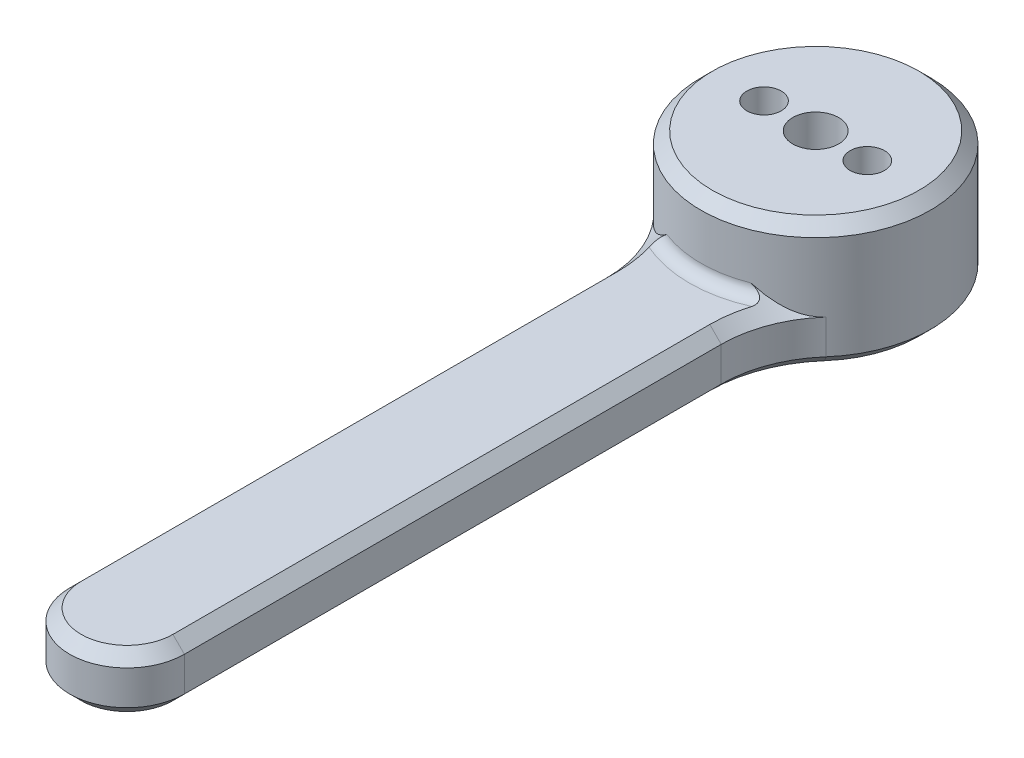
ISO-10303-21;
HEADER;
FILE_DESCRIPTION(('STEP AP214'),'2;1');
FILE_NAME('part.step','',(''),(''),'','','');
FILE_SCHEMA(('AUTOMOTIVE_DESIGN { 1 0 10303 214 1 1 1 1 }'));
ENDSEC;
DATA;
#1=APPLICATION_CONTEXT('core data for automotive mechanical design processes');
#2=APPLICATION_PROTOCOL_DEFINITION('international standard','automotive_design',2000,#1);
#3=PRODUCT_CONTEXT('',#1,'mechanical');
#4=PRODUCT('Part','Part','',(#3));
#5=PRODUCT_RELATED_PRODUCT_CATEGORY('part','',(#4));
#6=PRODUCT_DEFINITION_FORMATION('','',#4);
#7=PRODUCT_DEFINITION_CONTEXT('part definition',#1,'design');
#8=PRODUCT_DEFINITION('design','',#6,#7);
#9=PRODUCT_DEFINITION_SHAPE('','',#8);
#10=(LENGTH_UNIT() NAMED_UNIT(*) SI_UNIT(.MILLI.,.METRE.));
#11=(NAMED_UNIT(*) PLANE_ANGLE_UNIT() SI_UNIT($,.RADIAN.));
#12=(NAMED_UNIT(*) SI_UNIT($,.STERADIAN.) SOLID_ANGLE_UNIT());
#13=UNCERTAINTY_MEASURE_WITH_UNIT(LENGTH_MEASURE(1.E-05),#10,'distance_accuracy_value','');
#14=(GEOMETRIC_REPRESENTATION_CONTEXT(3) GLOBAL_UNCERTAINTY_ASSIGNED_CONTEXT((#13)) GLOBAL_UNIT_ASSIGNED_CONTEXT((#10,
#11,#12)) REPRESENTATION_CONTEXT('',''));
#15=CARTESIAN_POINT('',(0.,0.,0.));
#16=DIRECTION('',(0.,0.,1.));
#17=DIRECTION('',(1.,0.,0.));
#18=AXIS2_PLACEMENT_3D('',#15,#16,#17);
#19=CARTESIAN_POINT('',(30.,22.,26.4575131106459));
#20=DIRECTION('',(0.,-1.,0.));
#21=DIRECTION('',(0.,0.,-1.));
#22=AXIS2_PLACEMENT_3D('',#19,#20,#21);
#23=CYLINDRICAL_SURFACE('',#22,20.);
#24=DIRECTION('',(0.,-1.,0.));
#25=VECTOR('',#24,1.);
#26=CARTESIAN_POINT('',(15.,22.,13.228756555323));
#27=LINE('',#26,#25);
#28=CARTESIAN_POINT('',(15.,8.,13.228756555323));
#29=VERTEX_POINT('',#28);
#30=CARTESIAN_POINT('',(15.,1.99999999999999,13.228756555323));
#31=VERTEX_POINT('',#30);
#32=EDGE_CURVE('E133',#29,#31,#27,.T.);
#33=ORIENTED_EDGE('',*,*,#32,.F.);
#34=CARTESIAN_POINT('',(30.,8.,26.4575131106459));
#35=DIRECTION('',(0.,1.,0.));
#36=DIRECTION('',(0.,0.,1.));
#37=AXIS2_PLACEMENT_3D('',#34,#35,#36);
#38=CIRCLE('',#37,20.);
#39=CARTESIAN_POINT('',(9.99999999999999,8.,26.4575131106459));
#40=VERTEX_POINT('',#39);
#41=EDGE_CURVE('E142',#29,#40,#38,.T.);
#42=ORIENTED_EDGE('',*,*,#41,.T.);
#43=DIRECTION('',(0.,-1.,0.));
#44=VECTOR('',#43,1.);
#45=CARTESIAN_POINT('',(9.99999999999999,22.,26.4575131106459));
#46=LINE('',#45,#44);
#47=CARTESIAN_POINT('',(9.99999999999999,1.99999999999999,26.4575131106459));
#48=VERTEX_POINT('',#47);
#49=EDGE_CURVE('E383',#40,#48,#46,.T.);
#50=ORIENTED_EDGE('',*,*,#49,.T.);
#51=CARTESIAN_POINT('',(30.,1.99999999999999,26.4575131106459));
#52=DIRECTION('',(0.,-1.,0.));
#53=DIRECTION('',(0.,0.,-1.));
#54=AXIS2_PLACEMENT_3D('',#51,#52,#53);
#55=CIRCLE('',#54,20.);
#56=EDGE_CURVE('E145',#48,#31,#55,.T.);
#57=ORIENTED_EDGE('',*,*,#56,.T.);
#58=EDGE_LOOP('',(#33,#42,#50,#57));
#59=FACE_BOUND('',#58,.T.);
#60=ADVANCED_FACE('F33',(#59),#23,.F.);
#61=CARTESIAN_POINT('',(-30.,22.,26.4575131106459));
#62=DIRECTION('',(0.,-1.,0.));
#63=DIRECTION('',(0.,0.,-1.));
#64=AXIS2_PLACEMENT_3D('',#61,#62,#63);
#65=CYLINDRICAL_SURFACE('',#64,20.);
#66=DIRECTION('',(0.,-1.,0.));
#67=VECTOR('',#66,1.);
#68=CARTESIAN_POINT('',(-10.,22.,26.4575131106459));
#69=LINE('',#68,#67);
#70=CARTESIAN_POINT('',(-10.,8.,26.4575131106459));
#71=VERTEX_POINT('',#70);
#72=CARTESIAN_POINT('',(-10.,1.99999999999999,26.4575131106459));
#73=VERTEX_POINT('',#72);
#74=EDGE_CURVE('E281',#71,#73,#69,.T.);
#75=ORIENTED_EDGE('',*,*,#74,.F.);
#76=CARTESIAN_POINT('',(-30.,8.,26.4575131106459));
#77=DIRECTION('',(0.,1.,0.));
#78=DIRECTION('',(0.,0.,1.));
#79=AXIS2_PLACEMENT_3D('',#76,#77,#78);
#80=CIRCLE('',#79,20.);
#81=CARTESIAN_POINT('',(-15.,8.,13.228756555323));
#82=VERTEX_POINT('',#81);
#83=EDGE_CURVE('E165',#71,#82,#80,.T.);
#84=ORIENTED_EDGE('',*,*,#83,.T.);
#85=DIRECTION('',(0.,-1.,0.));
#86=VECTOR('',#85,1.);
#87=CARTESIAN_POINT('',(-15.,22.,13.228756555323));
#88=LINE('',#87,#86);
#89=CARTESIAN_POINT('',(-15.,1.99999999999999,13.228756555323));
#90=VERTEX_POINT('',#89);
#91=EDGE_CURVE('E147',#82,#90,#88,.T.);
#92=ORIENTED_EDGE('',*,*,#91,.T.);
#93=CARTESIAN_POINT('',(-30.,1.99999999999999,26.4575131106459));
#94=DIRECTION('',(0.,-1.,0.));
#95=DIRECTION('',(0.,0.,-1.));
#96=AXIS2_PLACEMENT_3D('',#93,#94,#95);
#97=CIRCLE('',#96,20.);
#98=EDGE_CURVE('E163',#90,#73,#97,.T.);
#99=ORIENTED_EDGE('',*,*,#98,.T.);
#100=EDGE_LOOP('',(#75,#84,#92,#99));
#101=FACE_BOUND('',#100,.T.);
#102=ADVANCED_FACE('F291',(#101),#65,.F.);
#103=CARTESIAN_POINT('',(-10.,22.,26.4575131106459));
#104=DIRECTION('',(1.,0.,0.));
#105=DIRECTION('',(0.,0.,-1.));
#106=AXIS2_PLACEMENT_3D('',#103,#104,#105);
#107=PLANE('',#106);
#108=DIRECTION('',(0.,-1.,0.));
#109=VECTOR('',#108,1.);
#110=CARTESIAN_POINT('',(-9.99999999999998,22.,120.));
#111=LINE('',#110,#109);
#112=CARTESIAN_POINT('',(-9.99999999999998,8.,120.));
#113=VERTEX_POINT('',#112);
#114=CARTESIAN_POINT('',(-9.99999999999998,1.99999999999999,120.));
#115=VERTEX_POINT('',#114);
#116=EDGE_CURVE('E271',#113,#115,#111,.T.);
#117=ORIENTED_EDGE('',*,*,#116,.F.);
#118=DIRECTION('',(0.,0.,-1.));
#119=VECTOR('',#118,1.);
#120=CARTESIAN_POINT('',(-10.,8.,26.4575131106459));
#121=LINE('',#120,#119);
#122=EDGE_CURVE('E173',#113,#71,#121,.T.);
#123=ORIENTED_EDGE('',*,*,#122,.T.);
#124=ORIENTED_EDGE('',*,*,#74,.T.);
#125=DIRECTION('',(0.,0.,1.));
#126=VECTOR('',#125,1.);
#127=CARTESIAN_POINT('',(-9.99999999999998,1.99999999999999,120.));
#128=LINE('',#127,#126);
#129=EDGE_CURVE('E171',#73,#115,#128,.T.);
#130=ORIENTED_EDGE('',*,*,#129,.T.);
#131=EDGE_LOOP('',(#117,#123,#124,#130));
#132=FACE_BOUND('',#131,.T.);
#133=ADVANCED_FACE('F277',(#132),#107,.F.);
#134=CARTESIAN_POINT('',(0.,22.,120.));
#135=DIRECTION('',(0.,-1.,0.));
#136=DIRECTION('',(0.,0.,-1.));
#137=AXIS2_PLACEMENT_3D('',#134,#135,#136);
#138=CYLINDRICAL_SURFACE('',#137,10.);
#139=DIRECTION('',(0.,-1.,0.));
#140=VECTOR('',#139,1.);
#141=CARTESIAN_POINT('',(10.,22.,120.));
#142=LINE('',#141,#140);
#143=CARTESIAN_POINT('',(10.,8.,120.));
#144=VERTEX_POINT('',#143);
#145=CARTESIAN_POINT('',(10.,1.99999999999999,120.));
#146=VERTEX_POINT('',#145);
#147=EDGE_CURVE('E274',#144,#146,#142,.T.);
#148=ORIENTED_EDGE('',*,*,#147,.F.);
#149=CARTESIAN_POINT('',(0.,8.,120.));
#150=DIRECTION('',(0.,1.,0.));
#151=DIRECTION('',(0.,0.,1.));
#152=AXIS2_PLACEMENT_3D('',#149,#150,#151);
#153=CIRCLE('',#152,10.);
#154=EDGE_CURVE('E169',#144,#113,#153,.F.);
#155=ORIENTED_EDGE('',*,*,#154,.T.);
#156=ORIENTED_EDGE('',*,*,#116,.T.);
#157=CARTESIAN_POINT('',(0.,1.99999999999999,120.));
#158=DIRECTION('',(0.,-1.,0.));
#159=DIRECTION('',(0.,0.,-1.));
#160=AXIS2_PLACEMENT_3D('',#157,#158,#159);
#161=CIRCLE('',#160,10.);
#162=EDGE_CURVE('E167',#115,#146,#161,.F.);
#163=ORIENTED_EDGE('',*,*,#162,.T.);
#164=EDGE_LOOP('',(#148,#155,#156,#163));
#165=FACE_BOUND('',#164,.T.);
#166=ADVANCED_FACE('F270',(#165),#138,.T.);
#167=CARTESIAN_POINT('',(9.99999999999999,22.,26.4575131106459));
#168=DIRECTION('',(-1.,0.,0.));
#169=DIRECTION('',(0.,0.,1.));
#170=AXIS2_PLACEMENT_3D('',#167,#168,#169);
#171=PLANE('',#170);
#172=ORIENTED_EDGE('',*,*,#49,.F.);
#173=DIRECTION('',(0.,0.,1.));
#174=VECTOR('',#173,1.);
#175=CARTESIAN_POINT('',(10.,8.,120.));
#176=LINE('',#175,#174);
#177=EDGE_CURVE('E156',#40,#144,#176,.T.);
#178=ORIENTED_EDGE('',*,*,#177,.T.);
#179=ORIENTED_EDGE('',*,*,#147,.T.);
#180=DIRECTION('',(0.,0.,-1.));
#181=VECTOR('',#180,1.);
#182=CARTESIAN_POINT('',(9.99999999999999,1.99999999999999,26.4575131106459));
#183=LINE('',#182,#181);
#184=EDGE_CURVE('E154',#146,#48,#183,.T.);
#185=ORIENTED_EDGE('',*,*,#184,.T.);
#186=EDGE_LOOP('',(#172,#178,#179,#185));
#187=FACE_BOUND('',#186,.T.);
#188=ADVANCED_FACE('F329',(#187),#171,.F.);
#189=CARTESIAN_POINT('',(0.,22.,0.));
#190=DIRECTION('',(0.,-1.,0.));
#191=DIRECTION('',(0.,0.,-1.));
#192=AXIS2_PLACEMENT_3D('',#189,#190,#191);
#193=CYLINDRICAL_SURFACE('',#192,20.);
#194=CARTESIAN_POINT('',(0.,20.,0.));
#195=DIRECTION('',(0.,-1.,0.));
#196=DIRECTION('',(0.,0.,-1.));
#197=AXIS2_PLACEMENT_3D('',#194,#195,#196);
#198=CIRCLE('',#197,20.);
#199=CARTESIAN_POINT('',(0.,20.,-20.));
#200=VERTEX_POINT('',#199);
#201=EDGE_CURVE('E301',#200,#200,#198,.T.);
#202=ORIENTED_EDGE('',*,*,#201,.T.);
#203=EDGE_LOOP('',(#202));
#204=FACE_BOUND('',#203,.T.);
#205=CARTESIAN_POINT('',(-15.,8.,13.228756555323));
#206=CARTESIAN_POINT('',(-14.8945196437784,7.99998937451424,13.3483653775392));
#207=CARTESIAN_POINT('',(-14.787623850051,8.00381679248454,13.4666835286611));
#208=CARTESIAN_POINT('',(-14.5713046565015,8.0190401344938,13.7004531801353));
#209=CARTESIAN_POINT('',(-14.4618816774729,8.03043480717898,13.8159051511774));
#210=CARTESIAN_POINT('',(-14.1307338546285,8.07574050850674,14.1570670638179));
#211=CARTESIAN_POINT('',(-13.9056407378035,8.12077423760808,14.3781373461747));
#212=CARTESIAN_POINT('',(-13.4528860445116,8.23744429553904,14.8025246147325));
#213=CARTESIAN_POINT('',(-13.2253211955874,8.30864919530486,15.0060668634501));
#214=CARTESIAN_POINT('',(-12.7662221807977,8.47485765893719,15.3985326730518));
#215=CARTESIAN_POINT('',(-12.5346865668284,8.56987008485869,15.5874507559196));
#216=CARTESIAN_POINT('',(-12.1106828820039,8.7618034559952,15.9182388795185));
#217=CARTESIAN_POINT('',(-11.9185624147117,8.85540267855916,16.062513747317));
#218=CARTESIAN_POINT('',(-11.533575753494,9.05476705641632,16.3411467766116));
#219=CARTESIAN_POINT('',(-11.3407097308283,9.16052956154867,16.4755070878778));
#220=CARTESIAN_POINT('',(-10.7595316014974,9.49488026042892,16.8656777962678));
#221=CARTESIAN_POINT('',(-10.3706543388993,9.73959067460286,17.1070201820193));
#222=CARTESIAN_POINT('',(-9.75824481276342,10.150481328731,17.4597725554455));
#223=CARTESIAN_POINT('',(-9.53421183863677,10.3062049554414,17.583024805532));
#224=CARTESIAN_POINT('',(-9.0866303809251,10.62662571987,17.8184474101731));
#225=CARTESIAN_POINT('',(-8.86308198680796,10.7913243886026,17.9306158647508));
#226=CARTESIAN_POINT('',(-8.41885374184933,11.1265654241388,18.1434011345231));
#227=CARTESIAN_POINT('',(-8.19816727710275,11.2970345361772,18.2441205571284));
#228=CARTESIAN_POINT('',(-7.75760552818345,11.6441419140209,18.4357555936368));
#229=CARTESIAN_POINT('',(-7.53772985768816,11.8207766573205,18.5266766879056));
#230=CARTESIAN_POINT('',(-7.31820922113513,12.,18.6130012033442));
#231=B_SPLINE_CURVE_WITH_KNOTS('',3,(#205,#206,#207,#208,#209,#210,#211,#212,#213,#214,#215,
#216,#217,#218,#219,#220,#221,#222,#223,#224,#225,#226,#227,#228,#229,#230),.UNSPECIFIED.,.F.,
.F.,(4,2,2,2,2,2,2,2,2,2,2,2,4),(0.,0.478307213991693,0.95653535273327,1.91078453133958,
2.84996114344179,3.78948787303274,4.56252629255247,5.33539659884689,6.88923500697517,
7.78714320566107,8.68520505712769,9.57444919142176,10.4631933468987),.UNSPECIFIED.);
#232=CARTESIAN_POINT('',(-7.31820922113511,12.,18.6130012033442));
#233=VERTEX_POINT('',#232);
#234=EDGE_CURVE('E53',#82,#233,#231,.T.);
#235=ORIENTED_EDGE('',*,*,#234,.T.);
#236=CARTESIAN_POINT('',(0.,12.,0.));
#237=DIRECTION('',(0.,1.,0.));
#238=DIRECTION('',(0.,0.,1.));
#239=AXIS2_PLACEMENT_3D('',#236,#237,#238);
#240=CIRCLE('',#239,20.);
#241=CARTESIAN_POINT('',(7.3182092211351,12.,18.6130012033442));
#242=VERTEX_POINT('',#241);
#243=EDGE_CURVE('E135',#233,#242,#240,.T.);
#244=ORIENTED_EDGE('',*,*,#243,.T.);
#245=CARTESIAN_POINT('',(7.3182092211351,12.,18.6130012033442));
#246=CARTESIAN_POINT('',(7.53736547972353,11.8210738543337,18.5268206004381));
#247=CARTESIAN_POINT('',(7.75687992111424,11.6447246752529,18.4360559253694));
#248=CARTESIAN_POINT('',(8.19669905953671,11.2981802048693,18.2447744620921));
#249=CARTESIAN_POINT('',(8.41700408643251,11.1279879202656,18.1442529951316));
#250=CARTESIAN_POINT('',(8.86120401429013,10.7927149370377,17.9315496225274));
#251=CARTESIAN_POINT('',(9.08510766375261,10.6277324426346,17.8192303072819));
#252=CARTESIAN_POINT('',(9.53345608153247,10.3067294619889,17.5834402709645));
#253=CARTESIAN_POINT('',(9.75790079869767,10.1507081607067,17.4599705666803));
#254=CARTESIAN_POINT('',(10.2216606389505,9.83956089346061,17.192841797329));
#255=CARTESIAN_POINT('',(10.4610001964104,9.68514319744237,17.0483938934991));
#256=CARTESIAN_POINT('',(10.939602226658,9.39081968124585,16.7453069387421));
#257=CARTESIAN_POINT('',(11.17886470536,9.25091102268515,16.586670674816));
#258=CARTESIAN_POINT('',(11.6548825246648,8.98938547529348,16.2556799127944));
#259=CARTESIAN_POINT('',(11.8916434567105,8.86764317207147,16.0834333609491));
#260=CARTESIAN_POINT('',(12.3632484670472,8.64442240738492,15.7238019448438));
#261=CARTESIAN_POINT('',(12.5980929660749,8.54293937674614,15.5364205074506));
#262=CARTESIAN_POINT('',(13.0184814418972,8.38114639526929,15.1848208155913));
#263=CARTESIAN_POINT('',(13.2046545053799,8.31666470996547,15.0232751639075));
#264=CARTESIAN_POINT('',(13.5735917431573,8.20455968075029,14.6907876326238));
#265=CARTESIAN_POINT('',(13.7563569528917,8.15693113443698,14.5198486715053));
#266=CARTESIAN_POINT('',(14.119593157925,8.0794010886478,14.1669325084537));
#267=CARTESIAN_POINT('',(14.3000055456693,8.04973238510147,13.9848426985291));
#268=CARTESIAN_POINT('',(14.5660792233331,8.01995069530632,13.7056892607607));
#269=CARTESIAN_POINT('',(14.6540695481164,8.0124769645401,13.6115708699729));
#270=CARTESIAN_POINT('',(14.8283494603519,8.00249917822024,13.4215009016629));
#271=CARTESIAN_POINT('',(14.9146389188325,7.9999954981064,13.3255491862034));
#272=CARTESIAN_POINT('',(15.,8.,13.228756555323));
#273=B_SPLINE_CURVE_WITH_KNOTS('',3,(#245,#246,#247,#248,#249,#250,#251,#252,#253,#254,#255,
#256,#257,#258,#259,#260,#261,#262,#263,#264,#265,#266,#267,#268,#269,#270,#271,#272),
.UNSPECIFIED.,.F.,.F.,(4,2,2,2,2,2,2,2,2,2,2,2,2,4),(0.,0.88728077003567,1.77498914698781,
2.67451461734387,3.57395814395492,4.53147706738585,5.48880831797879,6.43918990933986,
7.38935691366651,8.1530242833253,8.91645571013248,9.6895819269575,10.0766564302102,
10.463760172128),.UNSPECIFIED.);
#274=EDGE_CURVE('E60',#242,#29,#273,.T.);
#275=ORIENTED_EDGE('',*,*,#274,.T.);
#276=ORIENTED_EDGE('',*,*,#32,.T.);
#277=CARTESIAN_POINT('',(0.,1.99999999999999,0.));
#278=DIRECTION('',(0.,-1.,0.));
#279=DIRECTION('',(0.,0.,-1.));
#280=AXIS2_PLACEMENT_3D('',#277,#278,#279);
#281=CIRCLE('',#280,20.);
#282=EDGE_CURVE('E294',#31,#90,#281,.F.);
#283=ORIENTED_EDGE('',*,*,#282,.T.);
#284=ORIENTED_EDGE('',*,*,#91,.F.);
#285=EDGE_LOOP('',(#235,#244,#275,#276,#283,#284));
#286=FACE_BOUND('',#285,.T.);
#287=ADVANCED_FACE('F132',(#204,#286),#193,.T.);
#288=CARTESIAN_POINT('',(30.,22.,26.4575131106459));
#289=DIRECTION('',(0.,-1.,0.));
#290=DIRECTION('',(0.,0.,-1.));
#291=AXIS2_PLACEMENT_3D('',#288,#289,#290);
#292=PLANE('',#291);
#293=CARTESIAN_POINT('',(0.,22.,0.));
#294=DIRECTION('',(0.,-1.,0.));
#295=DIRECTION('',(0.,0.,-1.));
#296=AXIS2_PLACEMENT_3D('',#293,#294,#295);
#297=CIRCLE('',#296,18.0000000000001);
#298=CARTESIAN_POINT('',(0.,22.,-18.0000000000001));
#299=VERTEX_POINT('',#298);
#300=EDGE_CURVE('E146',#299,#299,#297,.F.);
#301=ORIENTED_EDGE('',*,*,#300,.T.);
#302=EDGE_LOOP('',(#301));
#303=FACE_BOUND('',#302,.T.);
#304=CARTESIAN_POINT('',(9.,22.,0.));
#305=DIRECTION('',(0.,-1.,0.));
#306=DIRECTION('',(0.,0.,1.));
#307=AXIS2_PLACEMENT_3D('',#304,#305,#306);
#308=CIRCLE('',#307,3.);
#309=CARTESIAN_POINT('',(9.,22.,3.));
#310=VERTEX_POINT('',#309);
#311=EDGE_CURVE('E252',#310,#310,#308,.T.);
#312=ORIENTED_EDGE('',*,*,#311,.T.);
#313=EDGE_LOOP('',(#312));
#314=FACE_BOUND('',#313,.T.);
#315=CARTESIAN_POINT('',(-9.,22.,0.));
#316=DIRECTION('',(0.,1.,0.));
#317=DIRECTION('',(0.,0.,1.));
#318=AXIS2_PLACEMENT_3D('',#315,#316,#317);
#319=CIRCLE('',#318,3.);
#320=CARTESIAN_POINT('',(-9.,22.,3.));
#321=VERTEX_POINT('',#320);
#322=EDGE_CURVE('E369',#321,#321,#319,.T.);
#323=ORIENTED_EDGE('',*,*,#322,.F.);
#324=EDGE_LOOP('',(#323));
#325=FACE_BOUND('',#324,.T.);
#326=CARTESIAN_POINT('',(0.,22.,0.));
#327=DIRECTION('',(0.,1.,0.));
#328=DIRECTION('',(0.,0.,1.));
#329=AXIS2_PLACEMENT_3D('',#326,#327,#328);
#330=CIRCLE('',#329,4.);
#331=CARTESIAN_POINT('',(0.,22.,4.));
#332=VERTEX_POINT('',#331);
#333=EDGE_CURVE('E378',#332,#332,#330,.T.);
#334=ORIENTED_EDGE('',*,*,#333,.F.);
#335=EDGE_LOOP('',(#334));
#336=FACE_BOUND('',#335,.T.);
#337=ADVANCED_FACE('F336',(#303,#314,#325,#336),#292,.F.);
#338=CARTESIAN_POINT('',(30.,0.,26.4575131106459));
#339=DIRECTION('',(0.,-1.,0.));
#340=DIRECTION('',(0.,0.,-1.));
#341=AXIS2_PLACEMENT_3D('',#338,#339,#340);
#342=PLANE('',#341);
#343=CARTESIAN_POINT('',(0.,0.,0.));
#344=DIRECTION('',(0.,-1.,0.));
#345=DIRECTION('',(0.,0.,-1.));
#346=AXIS2_PLACEMENT_3D('',#343,#344,#345);
#347=CIRCLE('',#346,18.);
#348=CARTESIAN_POINT('',(-13.5,0.,11.9058808997907));
#349=VERTEX_POINT('',#348);
#350=CARTESIAN_POINT('',(13.5,0.,11.9058808997907));
#351=VERTEX_POINT('',#350);
#352=EDGE_CURVE('E183',#349,#351,#347,.T.);
#353=ORIENTED_EDGE('',*,*,#352,.T.);
#354=CARTESIAN_POINT('',(30.,0.,26.4575131106459));
#355=DIRECTION('',(0.,-1.,0.));
#356=DIRECTION('',(0.,0.,-1.));
#357=AXIS2_PLACEMENT_3D('',#354,#355,#356);
#358=CIRCLE('',#357,22.);
#359=CARTESIAN_POINT('',(7.99999999999999,0.,26.4575131106459));
#360=VERTEX_POINT('',#359);
#361=EDGE_CURVE('E137',#351,#360,#358,.F.);
#362=ORIENTED_EDGE('',*,*,#361,.T.);
#363=DIRECTION('',(0.,0.,1.));
#364=VECTOR('',#363,1.);
#365=CARTESIAN_POINT('',(8.00000000000002,0.,120.));
#366=LINE('',#365,#364);
#367=CARTESIAN_POINT('',(8.00000000000002,0.,120.));
#368=VERTEX_POINT('',#367);
#369=EDGE_CURVE('E181',#360,#368,#366,.T.);
#370=ORIENTED_EDGE('',*,*,#369,.T.);
#371=CARTESIAN_POINT('',(0.,0.,120.));
#372=DIRECTION('',(0.,-1.,0.));
#373=DIRECTION('',(0.,0.,-1.));
#374=AXIS2_PLACEMENT_3D('',#371,#372,#373);
#375=CIRCLE('',#374,8.);
#376=CARTESIAN_POINT('',(-7.99999999999999,0.,120.));
#377=VERTEX_POINT('',#376);
#378=EDGE_CURVE('E177',#368,#377,#375,.T.);
#379=ORIENTED_EDGE('',*,*,#378,.T.);
#380=DIRECTION('',(0.,0.,-1.));
#381=VECTOR('',#380,1.);
#382=CARTESIAN_POINT('',(-8.00000000000001,0.,26.4575131106459));
#383=LINE('',#382,#381);
#384=CARTESIAN_POINT('',(-8.00000000000001,0.,26.4575131106459));
#385=VERTEX_POINT('',#384);
#386=EDGE_CURVE('E175',#377,#385,#383,.T.);
#387=ORIENTED_EDGE('',*,*,#386,.T.);
#388=CARTESIAN_POINT('',(-30.,0.,26.4575131106459));
#389=DIRECTION('',(0.,-1.,0.));
#390=DIRECTION('',(0.,0.,-1.));
#391=AXIS2_PLACEMENT_3D('',#388,#389,#390);
#392=CIRCLE('',#391,22.);
#393=EDGE_CURVE('E179',#385,#349,#392,.F.);
#394=ORIENTED_EDGE('',*,*,#393,.T.);
#395=EDGE_LOOP('',(#353,#362,#370,#379,#387,#394));
#396=FACE_BOUND('',#395,.T.);
#397=CARTESIAN_POINT('',(0.,0.,0.));
#398=DIRECTION('',(0.,1.,0.));
#399=DIRECTION('',(0.,0.,1.));
#400=AXIS2_PLACEMENT_3D('',#397,#398,#399);
#401=CIRCLE('',#400,4.);
#402=CARTESIAN_POINT('',(0.,0.,4.));
#403=VERTEX_POINT('',#402);
#404=EDGE_CURVE('E380',#403,#403,#401,.T.);
#405=ORIENTED_EDGE('',*,*,#404,.T.);
#406=EDGE_LOOP('',(#405));
#407=FACE_BOUND('',#406,.T.);
#408=ADVANCED_FACE('F333',(#396,#407),#342,.T.);
#409=CARTESIAN_POINT('',(0.,10.,0.));
#410=DIRECTION('',(0.,1.,0.));
#411=DIRECTION('',(0.,0.,1.));
#412=AXIS2_PLACEMENT_3D('',#409,#410,#411);
#413=PLANE('',#412);
#414=CARTESIAN_POINT('',(30.,10.,26.4575131106459));
#415=DIRECTION('',(0.,1.,0.));
#416=DIRECTION('',(0.,0.,1.));
#417=AXIS2_PLACEMENT_3D('',#414,#415,#416);
#418=CIRCLE('',#417,22.);
#419=CARTESIAN_POINT('',(8.,10.,26.4575131106459));
#420=VERTEX_POINT('',#419);
#421=CARTESIAN_POINT('',(8.93782217350894,10.,20.1026200977567));
#422=VERTEX_POINT('',#421);
#423=EDGE_CURVE('E158',#420,#422,#418,.F.);
#424=ORIENTED_EDGE('',*,*,#423,.T.);
#425=CARTESIAN_POINT('',(0.,10.,0.));
#426=DIRECTION('',(0.,1.,0.));
#427=DIRECTION('',(0.,0.,1.));
#428=AXIS2_PLACEMENT_3D('',#425,#426,#427);
#429=CIRCLE('',#428,22.);
#430=CARTESIAN_POINT('',(-8.93782217350896,10.,20.1026200977567));
#431=VERTEX_POINT('',#430);
#432=EDGE_CURVE('E230',#422,#431,#429,.F.);
#433=ORIENTED_EDGE('',*,*,#432,.T.);
#434=CARTESIAN_POINT('',(-30.,10.,26.4575131106459));
#435=DIRECTION('',(0.,1.,0.));
#436=DIRECTION('',(0.,0.,1.));
#437=AXIS2_PLACEMENT_3D('',#434,#435,#436);
#438=CIRCLE('',#437,22.);
#439=CARTESIAN_POINT('',(-8.00000000000002,10.,26.4575131106459));
#440=VERTEX_POINT('',#439);
#441=EDGE_CURVE('E288',#431,#440,#438,.F.);
#442=ORIENTED_EDGE('',*,*,#441,.T.);
#443=DIRECTION('',(0.,0.,1.));
#444=VECTOR('',#443,1.);
#445=CARTESIAN_POINT('',(-8.,10.,120.));
#446=LINE('',#445,#444);
#447=CARTESIAN_POINT('',(-8.,10.,120.));
#448=VERTEX_POINT('',#447);
#449=EDGE_CURVE('E285',#440,#448,#446,.T.);
#450=ORIENTED_EDGE('',*,*,#449,.T.);
#451=CARTESIAN_POINT('',(0.,10.,120.));
#452=DIRECTION('',(0.,1.,0.));
#453=DIRECTION('',(0.,0.,1.));
#454=AXIS2_PLACEMENT_3D('',#451,#452,#453);
#455=CIRCLE('',#454,8.00000000000001);
#456=CARTESIAN_POINT('',(8.00000000000003,10.,120.));
#457=VERTEX_POINT('',#456);
#458=EDGE_CURVE('E264',#448,#457,#455,.T.);
#459=ORIENTED_EDGE('',*,*,#458,.T.);
#460=DIRECTION('',(0.,0.,-1.));
#461=VECTOR('',#460,1.);
#462=CARTESIAN_POINT('',(8.,10.,26.4575131106459));
#463=LINE('',#462,#461);
#464=EDGE_CURVE('E261',#457,#420,#463,.T.);
#465=ORIENTED_EDGE('',*,*,#464,.T.);
#466=EDGE_LOOP('',(#424,#433,#442,#450,#459,#465));
#467=FACE_BOUND('',#466,.T.);
#468=ADVANCED_FACE('F310',(#467),#413,.T.);
#469=CARTESIAN_POINT('',(0.,0.,0.));
#470=DIRECTION('',(0.,1.,0.));
#471=DIRECTION('',(0.,0.,1.));
#472=AXIS2_PLACEMENT_3D('',#469,#470,#471);
#473=CYLINDRICAL_SURFACE('',#472,4.);
#474=ORIENTED_EDGE('',*,*,#404,.F.);
#475=EDGE_LOOP('',(#474));
#476=FACE_BOUND('',#475,.T.);
#477=ORIENTED_EDGE('',*,*,#333,.T.);
#478=EDGE_LOOP('',(#477));
#479=FACE_BOUND('',#478,.T.);
#480=ADVANCED_FACE('F343',(#476,#479),#473,.F.);
#481=CARTESIAN_POINT('',(-9.,2.,0.));
#482=DIRECTION('',(0.,1.,0.));
#483=DIRECTION('',(0.,0.,1.));
#484=AXIS2_PLACEMENT_3D('',#481,#482,#483);
#485=CYLINDRICAL_SURFACE('',#484,3.);
#486=CARTESIAN_POINT('',(-9.,2.,0.));
#487=DIRECTION('',(0.,1.,0.));
#488=DIRECTION('',(0.,0.,1.));
#489=AXIS2_PLACEMENT_3D('',#486,#487,#488);
#490=CIRCLE('',#489,3.);
#491=CARTESIAN_POINT('',(-9.,2.,3.));
#492=VERTEX_POINT('',#491);
#493=EDGE_CURVE('E372',#492,#492,#490,.T.);
#494=ORIENTED_EDGE('',*,*,#493,.F.);
#495=EDGE_LOOP('',(#494));
#496=FACE_BOUND('',#495,.T.);
#497=ORIENTED_EDGE('',*,*,#322,.T.);
#498=EDGE_LOOP('',(#497));
#499=FACE_BOUND('',#498,.T.);
#500=ADVANCED_FACE('F346',(#496,#499),#485,.F.);
#501=CARTESIAN_POINT('',(-9.,2.,0.));
#502=DIRECTION('',(0.,1.,0.));
#503=DIRECTION('',(0.,0.,1.));
#504=AXIS2_PLACEMENT_3D('',#501,#502,#503);
#505=PLANE('',#504);
#506=ORIENTED_EDGE('',*,*,#493,.T.);
#507=EDGE_LOOP('',(#506));
#508=FACE_BOUND('',#507,.T.);
#509=ADVANCED_FACE('F350',(#508),#505,.T.);
#510=CARTESIAN_POINT('',(9.,2.,0.));
#511=DIRECTION('',(0.,1.,0.));
#512=DIRECTION('',(0.,0.,1.));
#513=AXIS2_PLACEMENT_3D('',#510,#511,#512);
#514=CYLINDRICAL_SURFACE('',#513,3.);
#515=CARTESIAN_POINT('',(9.,2.,0.));
#516=DIRECTION('',(0.,-1.,0.));
#517=DIRECTION('',(0.,0.,1.));
#518=AXIS2_PLACEMENT_3D('',#515,#516,#517);
#519=CIRCLE('',#518,3.);
#520=CARTESIAN_POINT('',(9.,2.,3.));
#521=VERTEX_POINT('',#520);
#522=EDGE_CURVE('E368',#521,#521,#519,.T.);
#523=ORIENTED_EDGE('',*,*,#522,.T.);
#524=EDGE_LOOP('',(#523));
#525=FACE_BOUND('',#524,.T.);
#526=ORIENTED_EDGE('',*,*,#311,.F.);
#527=EDGE_LOOP('',(#526));
#528=FACE_BOUND('',#527,.T.);
#529=ADVANCED_FACE('F354',(#525,#528),#514,.F.);
#530=CARTESIAN_POINT('',(9.,2.,0.));
#531=DIRECTION('',(0.,1.,0.));
#532=DIRECTION('',(0.,0.,1.));
#533=AXIS2_PLACEMENT_3D('',#530,#531,#532);
#534=PLANE('',#533);
#535=ORIENTED_EDGE('',*,*,#522,.F.);
#536=EDGE_LOOP('',(#535));
#537=FACE_BOUND('',#536,.T.);
#538=ADVANCED_FACE('F358',(#537),#534,.T.);
#539=CARTESIAN_POINT('',(0.,22.,0.));
#540=DIRECTION('',(0.,-1.,0.));
#541=DIRECTION('',(0.,0.,-1.));
#542=AXIS2_PLACEMENT_3D('',#539,#540,#541);
#543=CONICAL_SURFACE('',#542,18.0000000000001,0.785398163397445);
#544=ORIENTED_EDGE('',*,*,#201,.F.);
#545=EDGE_LOOP('',(#544));
#546=FACE_BOUND('',#545,.T.);
#547=ORIENTED_EDGE('',*,*,#300,.F.);
#548=EDGE_LOOP('',(#547));
#549=FACE_BOUND('',#548,.T.);
#550=ADVANCED_FACE('F205',(#546,#549),#543,.T.);
#551=CARTESIAN_POINT('',(-30.,10.,26.4575131106459));
#552=DIRECTION('',(0.,1.,0.));
#553=DIRECTION('',(0.,0.,1.));
#554=AXIS2_PLACEMENT_3D('',#551,#552,#553);
#555=CONICAL_SURFACE('',#554,22.,0.785398163397445);
#556=ORIENTED_EDGE('',*,*,#234,.F.);
#557=ORIENTED_EDGE('',*,*,#83,.F.);
#558=DIRECTION('',(-0.707106781186545,-0.70710678118655,0.));
#559=VECTOR('',#558,1.);
#560=CARTESIAN_POINT('',(-8.00000000000002,10.,26.4575131106459));
#561=LINE('',#560,#559);
#562=EDGE_CURVE('E249',#440,#71,#561,.T.);
#563=ORIENTED_EDGE('',*,*,#562,.F.);
#564=ORIENTED_EDGE('',*,*,#441,.F.);
#565=CARTESIAN_POINT('',(-8.93782217350895,10.,20.1026200977567));
#566=CARTESIAN_POINT('',(-8.95202197975623,10.000006391474,20.0555349299035));
#567=CARTESIAN_POINT('',(-8.96539211083177,10.0010410755638,20.0082123643707));
#568=CARTESIAN_POINT('',(-8.99024867625293,10.0053794604418,19.913088186428));
#569=CARTESIAN_POINT('',(-9.00173160215699,10.0086873294054,19.8652858532331));
#570=CARTESIAN_POINT('',(-9.0332219092578,10.0224598835678,19.7201021461714));
#571=CARTESIAN_POINT('',(-9.0498670216568,10.0367858458204,19.6222393862893));
#572=CARTESIAN_POINT('',(-9.06841471302887,10.0725697173743,19.452357352149));
#573=CARTESIAN_POINT('',(-9.07298193234922,10.0913057611154,19.3800645842085));
#574=CARTESIAN_POINT('',(-9.07366532821732,10.136539704796,19.2381375353676));
#575=CARTESIAN_POINT('',(-9.06982391566401,10.1629980718095,19.1684917072809));
#576=CARTESIAN_POINT('',(-9.05383328048785,10.218114800938,19.0477172226962));
#577=CARTESIAN_POINT('',(-9.04350073517239,10.2452729345778,18.9956723506753));
#578=CARTESIAN_POINT('',(-9.01581725149621,10.304745335254,18.896593798285));
#579=CARTESIAN_POINT('',(-8.99846864280011,10.3370578886248,18.8495584610563));
#580=CARTESIAN_POINT('',(-8.95679970155794,10.4061179429063,18.7621242185443));
#581=CARTESIAN_POINT('',(-8.93246431611318,10.4428749192024,18.7217399417056));
#582=CARTESIAN_POINT('',(-8.8777165133569,10.5194682441094,18.6487868932611));
#583=CARTESIAN_POINT('',(-8.84730068383294,10.5593063140315,18.6162225327104));
#584=CARTESIAN_POINT('',(-8.77375625970037,10.6505845933161,18.5520757399591));
#585=CARTESIAN_POINT('',(-8.72933476714108,10.7024906771548,18.5226570768195));
#586=CARTESIAN_POINT('',(-8.63569492457837,10.806971638993,18.4747541523358));
#587=CARTESIAN_POINT('',(-8.58646732053892,10.859547630725,18.4562914900438));
#588=CARTESIAN_POINT('',(-8.45287345699512,10.9975761032855,18.4194835591446));
#589=CARTESIAN_POINT('',(-8.366095348736,11.0826416040267,18.4087015935996));
#590=CARTESIAN_POINT('',(-8.18919348455427,11.2501482087778,18.404011657641));
#591=CARTESIAN_POINT('',(-8.09905301771748,11.332570879687,18.4102035630249));
#592=CARTESIAN_POINT('',(-7.95054428187203,11.4651142183123,18.4304437195835));
#593=CARTESIAN_POINT('',(-7.8924500217292,11.5161573005249,18.4408501618632));
#594=CARTESIAN_POINT('',(-7.77611268909233,11.617070145476,18.4659032801277));
#595=CARTESIAN_POINT('',(-7.717869559634,11.6669393473504,18.4805519402409));
#596=CARTESIAN_POINT('',(-7.60256793540755,11.7646114369948,18.5131456727796));
#597=CARTESIAN_POINT('',(-7.54550793843803,11.8124355786129,18.5310228998699));
#598=CARTESIAN_POINT('',(-7.43165094769677,11.9069990770868,18.5698254461634));
#599=CARTESIAN_POINT('',(-7.3748537140045,11.9537397177901,18.5907469190131));
#600=CARTESIAN_POINT('',(-7.31820922113511,12.,18.6130012033442));
#601=B_SPLINE_CURVE_WITH_KNOTS('',3,(#565,#566,#567,#568,#569,#570,#571,#572,#573,#574,#575,
#576,#577,#578,#579,#580,#581,#582,#583,#584,#585,#586,#587,#588,#589,#590,#591,#592,#593,#594,
#595,#596,#597,#598,#599,#600),.UNSPECIFIED.,.F.,.F.,(4,2,2,2,2,2,2,2,2,2,2,2,2,2,2,2,2,4),(0.,
0.147486497405605,0.295244154305455,0.594802958939788,0.818563128675198,1.04119731332,
1.21927167183768,1.39728694973761,1.57568867439678,1.75419079667512,1.97609300957342,
2.1984312474804,2.56237022715707,2.92845524602725,3.16242120950308,3.39649677845396,
3.62612944787418,3.85547445981714),.UNSPECIFIED.);
#602=EDGE_CURVE('E46',#431,#233,#601,.T.);
#603=ORIENTED_EDGE('',*,*,#602,.T.);
#604=EDGE_LOOP('',(#556,#557,#563,#564,#603));
#605=FACE_BOUND('',#604,.T.);
#606=ADVANCED_FACE('F216',(#605),#555,.F.);
#607=CARTESIAN_POINT('',(-8.00000000000003,10.,0.));
#608=DIRECTION('',(-0.70710678118655,0.707106781186545,0.));
#609=DIRECTION('',(0.,0.,-1.));
#610=AXIS2_PLACEMENT_3D('',#607,#608,#609);
#611=PLANE('',#610);
#612=ORIENTED_EDGE('',*,*,#562,.T.);
#613=ORIENTED_EDGE('',*,*,#122,.F.);
#614=DIRECTION('',(-0.707106781186545,-0.70710678118655,0.));
#615=VECTOR('',#614,1.);
#616=CARTESIAN_POINT('',(-8.,10.,120.));
#617=LINE('',#616,#615);
#618=EDGE_CURVE('E253',#448,#113,#617,.T.);
#619=ORIENTED_EDGE('',*,*,#618,.F.);
#620=ORIENTED_EDGE('',*,*,#449,.F.);
#621=EDGE_LOOP('',(#612,#613,#619,#620));
#622=FACE_BOUND('',#621,.T.);
#623=ADVANCED_FACE('F213',(#622),#611,.T.);
#624=CARTESIAN_POINT('',(0.,10.,120.));
#625=DIRECTION('',(0.,-1.,0.));
#626=DIRECTION('',(0.,0.,-1.));
#627=AXIS2_PLACEMENT_3D('',#624,#625,#626);
#628=CONICAL_SURFACE('',#627,8.00000000000001,0.785398163397445);
#629=ORIENTED_EDGE('',*,*,#618,.T.);
#630=ORIENTED_EDGE('',*,*,#154,.F.);
#631=DIRECTION('',(0.707106781186545,-0.70710678118655,0.));
#632=VECTOR('',#631,1.);
#633=CARTESIAN_POINT('',(8.00000000000003,10.,120.));
#634=LINE('',#633,#632);
#635=EDGE_CURVE('E256',#457,#144,#634,.T.);
#636=ORIENTED_EDGE('',*,*,#635,.F.);
#637=ORIENTED_EDGE('',*,*,#458,.F.);
#638=EDGE_LOOP('',(#629,#630,#636,#637));
#639=FACE_BOUND('',#638,.T.);
#640=ADVANCED_FACE('F209',(#639),#628,.T.);
#641=CARTESIAN_POINT('',(7.99999999999999,10.,0.));
#642=DIRECTION('',(0.70710678118655,0.707106781186545,0.));
#643=DIRECTION('',(0.,0.,1.));
#644=AXIS2_PLACEMENT_3D('',#641,#642,#643);
#645=PLANE('',#644);
#646=ORIENTED_EDGE('',*,*,#635,.T.);
#647=ORIENTED_EDGE('',*,*,#177,.F.);
#648=DIRECTION('',(0.707106781186545,-0.70710678118655,0.));
#649=VECTOR('',#648,1.);
#650=CARTESIAN_POINT('',(8.,10.,26.4575131106459));
#651=LINE('',#650,#649);
#652=EDGE_CURVE('E153',#420,#40,#651,.T.);
#653=ORIENTED_EDGE('',*,*,#652,.F.);
#654=ORIENTED_EDGE('',*,*,#464,.F.);
#655=EDGE_LOOP('',(#646,#647,#653,#654));
#656=FACE_BOUND('',#655,.T.);
#657=ADVANCED_FACE('F204',(#656),#645,.T.);
#658=CARTESIAN_POINT('',(30.,10.,26.4575131106459));
#659=DIRECTION('',(0.,1.,0.));
#660=DIRECTION('',(0.,0.,1.));
#661=AXIS2_PLACEMENT_3D('',#658,#659,#660);
#662=CONICAL_SURFACE('',#661,22.,0.785398163397445);
#663=ORIENTED_EDGE('',*,*,#652,.T.);
#664=ORIENTED_EDGE('',*,*,#41,.F.);
#665=ORIENTED_EDGE('',*,*,#274,.F.);
#666=CARTESIAN_POINT('',(7.3182092211351,12.,18.6130012033442));
#667=CARTESIAN_POINT('',(7.35491162657324,11.9700294506972,18.5985726261743));
#668=CARTESIAN_POINT('',(7.39167271023232,11.93985800697,18.5847152494276));
#669=CARTESIAN_POINT('',(7.4652973029495,11.8790888063496,18.5582306415413));
#670=CARTESIAN_POINT('',(7.50216082968057,11.8484909717034,18.5456036382083));
#671=CARTESIAN_POINT('',(7.61316838794773,11.755782157395,18.5096083042727));
#672=CARTESIAN_POINT('',(7.68742451772284,11.6930042049261,18.4882469088808));
#673=CARTESIAN_POINT('',(7.83709308973338,11.5645204095032,18.4516392795297));
#674=CARTESIAN_POINT('',(7.91250491308502,11.498783709313,18.436496968304));
#675=CARTESIAN_POINT('',(8.06260653911728,11.3653117733943,18.4145125144737));
#676=CARTESIAN_POINT('',(8.13729744509108,11.2975805912809,18.4076545862527));
#677=CARTESIAN_POINT('',(8.27043263092269,11.1736217328361,18.4049906007254));
#678=CARTESIAN_POINT('',(8.32917096548023,11.1177654819772,18.4072685199032));
#679=CARTESIAN_POINT('',(8.44457001956417,11.0049678216911,18.4205870687813));
#680=CARTESIAN_POINT('',(8.50123300600436,10.9480277062115,18.4316178198022));
#681=CARTESIAN_POINT('',(8.61174577379576,10.8328208442149,18.4649969570308));
#682=CARTESIAN_POINT('',(8.66554090212196,10.7745469851044,18.4875119089536));
#683=CARTESIAN_POINT('',(8.76647838344275,10.6593455170473,18.5465317984376));
#684=CARTESIAN_POINT('',(8.81364340109631,10.6024139042607,18.5829874074682));
#685=CARTESIAN_POINT('',(8.88545599812356,10.5089867788768,18.6580998639667));
#686=CARTESIAN_POINT('',(8.91264870302597,10.471399601177,18.6929664402784));
#687=CARTESIAN_POINT('',(8.96090037651827,10.3996484521946,18.7697756026274));
#688=CARTESIAN_POINT('',(8.98196082099274,10.3654836585289,18.8117164822094));
#689=CARTESIAN_POINT('',(9.01737205791681,10.3016870520686,18.9013328705387));
#690=CARTESIAN_POINT('',(9.03173279702452,10.2720485636264,18.9489997450728));
#691=CARTESIAN_POINT('',(9.0539663434363,10.2177513417051,19.0484637023276));
#692=CARTESIAN_POINT('',(9.0618362422972,10.1930948443096,19.1002626251655));
#693=CARTESIAN_POINT('',(9.07369553943542,10.1399666874146,19.2275432704767));
#694=CARTESIAN_POINT('',(9.07490489248625,10.1138651245651,19.3042646039927));
#695=CARTESIAN_POINT('',(9.06815336604923,10.070393066193,19.459963039874));
#696=CARTESIAN_POINT('',(9.06014771838667,10.0530657887548,19.5389493214543));
#697=CARTESIAN_POINT('',(9.03656884323143,10.0255694384702,19.6997862426176));
#698=CARTESIAN_POINT('',(9.0207453420464,10.015666425209,19.7816421578606));
#699=CARTESIAN_POINT('',(8.98324185916657,10.0029471089536,19.9434923232098));
#700=CARTESIAN_POINT('',(8.96163861759389,10.0000426088246,20.023497020428));
#701=CARTESIAN_POINT('',(8.93782217350894,10.,20.1026200977567));
#702=B_SPLINE_CURVE_WITH_KNOTS('',3,(#666,#667,#668,#669,#670,#671,#672,#673,#674,#675,#676,
#677,#678,#679,#680,#681,#682,#683,#684,#685,#686,#687,#688,#689,#690,#691,#692,#693,#694,#695,
#696,#697,#698,#699,#700,#701),.UNSPECIFIED.,.F.,.F.,(4,2,2,2,2,2,2,2,2,2,2,2,2,2,2,2,2,4),(0.,
0.148590205448921,0.297207870665374,0.595676061808213,0.898946587492151,1.20163832510654,
1.44452010427627,1.68712814982548,1.93335948668679,2.17872748624636,2.35204007015323,
2.52531090743161,2.69832367457679,2.87141392396119,3.11320595693404,3.3561776358807,
3.60748754559086,3.85561342361331),.UNSPECIFIED.);
#703=EDGE_CURVE('E11',#242,#422,#702,.T.);
#704=ORIENTED_EDGE('',*,*,#703,.T.);
#705=ORIENTED_EDGE('',*,*,#423,.F.);
#706=EDGE_LOOP('',(#663,#664,#665,#704,#705));
#707=FACE_BOUND('',#706,.T.);
#708=ADVANCED_FACE('F150',(#707),#662,.F.);
#709=CARTESIAN_POINT('',(-10.,1.99999999999999,26.4575131106459));
#710=DIRECTION('',(-0.707106781186546,-0.707106781186549,0.));
#711=DIRECTION('',(0.,0.,-1.));
#712=AXIS2_PLACEMENT_3D('',#709,#710,#711);
#713=PLANE('',#712);
#714=DIRECTION('',(-0.707106781186549,0.707106781186546,0.));
#715=VECTOR('',#714,1.);
#716=CARTESIAN_POINT('',(-8.00000000000001,0.,26.4575131106459));
#717=LINE('',#716,#715);
#718=EDGE_CURVE('E236',#385,#73,#717,.T.);
#719=ORIENTED_EDGE('',*,*,#718,.F.);
#720=ORIENTED_EDGE('',*,*,#386,.F.);
#721=DIRECTION('',(0.707106781186549,-0.707106781186546,0.));
#722=VECTOR('',#721,1.);
#723=CARTESIAN_POINT('',(-9.99999999999998,1.99999999999999,120.));
#724=LINE('',#723,#722);
#725=EDGE_CURVE('E233',#115,#377,#724,.T.);
#726=ORIENTED_EDGE('',*,*,#725,.F.);
#727=ORIENTED_EDGE('',*,*,#129,.F.);
#728=EDGE_LOOP('',(#719,#720,#726,#727));
#729=FACE_BOUND('',#728,.T.);
#730=ADVANCED_FACE('F203',(#729),#713,.T.);
#731=CARTESIAN_POINT('',(0.,1.99999999999999,120.));
#732=DIRECTION('',(0.,1.,0.));
#733=DIRECTION('',(0.,0.,1.));
#734=AXIS2_PLACEMENT_3D('',#731,#732,#733);
#735=CONICAL_SURFACE('',#734,10.,0.785398163397452);
#736=ORIENTED_EDGE('',*,*,#725,.T.);
#737=ORIENTED_EDGE('',*,*,#378,.F.);
#738=DIRECTION('',(-0.70710678118655,-0.707106781186545,0.));
#739=VECTOR('',#738,1.);
#740=CARTESIAN_POINT('',(10.,1.99999999999999,120.));
#741=LINE('',#740,#739);
#742=EDGE_CURVE('E239',#146,#368,#741,.T.);
#743=ORIENTED_EDGE('',*,*,#742,.F.);
#744=ORIENTED_EDGE('',*,*,#162,.F.);
#745=EDGE_LOOP('',(#736,#737,#743,#744));
#746=FACE_BOUND('',#745,.T.);
#747=ADVANCED_FACE('F392',(#746),#735,.T.);
#748=CARTESIAN_POINT('',(-30.,1.99999999999999,26.4575131106459));
#749=DIRECTION('',(0.,-1.,0.));
#750=DIRECTION('',(0.,0.,-1.));
#751=AXIS2_PLACEMENT_3D('',#748,#749,#750);
#752=CONICAL_SURFACE('',#751,20.,0.785398163397452);
#753=ORIENTED_EDGE('',*,*,#718,.T.);
#754=ORIENTED_EDGE('',*,*,#98,.F.);
#755=DIRECTION('',(-0.530330085889912,0.707106781186545,0.467707173346744));
#756=VECTOR('',#755,1.);
#757=CARTESIAN_POINT('',(-13.5,0.,11.9058808997907));
#758=LINE('',#757,#756);
#759=EDGE_CURVE('E242',#349,#90,#758,.T.);
#760=ORIENTED_EDGE('',*,*,#759,.F.);
#761=ORIENTED_EDGE('',*,*,#393,.F.);
#762=EDGE_LOOP('',(#753,#754,#760,#761));
#763=FACE_BOUND('',#762,.T.);
#764=ADVANCED_FACE('F404',(#763),#752,.F.);
#765=CARTESIAN_POINT('',(9.99999999999999,1.99999999999999,26.4575131106459));
#766=DIRECTION('',(0.707106781186545,-0.70710678118655,0.));
#767=DIRECTION('',(0.,0.,1.));
#768=AXIS2_PLACEMENT_3D('',#765,#766,#767);
#769=PLANE('',#768);
#770=ORIENTED_EDGE('',*,*,#742,.T.);
#771=ORIENTED_EDGE('',*,*,#369,.F.);
#772=DIRECTION('',(-0.70710678118655,-0.707106781186545,0.));
#773=VECTOR('',#772,1.);
#774=CARTESIAN_POINT('',(9.99999999999999,1.99999999999999,26.4575131106459));
#775=LINE('',#774,#773);
#776=EDGE_CURVE('E245',#48,#360,#775,.T.);
#777=ORIENTED_EDGE('',*,*,#776,.F.);
#778=ORIENTED_EDGE('',*,*,#184,.F.);
#779=EDGE_LOOP('',(#770,#771,#777,#778));
#780=FACE_BOUND('',#779,.T.);
#781=ADVANCED_FACE('F396',(#780),#769,.T.);
#782=CARTESIAN_POINT('',(0.,1.99999999999999,0.));
#783=DIRECTION('',(0.,1.,0.));
#784=DIRECTION('',(0.,0.,1.));
#785=AXIS2_PLACEMENT_3D('',#782,#783,#784);
#786=CONICAL_SURFACE('',#785,20.,0.785398163397452);
#787=ORIENTED_EDGE('',*,*,#759,.T.);
#788=ORIENTED_EDGE('',*,*,#282,.F.);
#789=DIRECTION('',(0.530330085889912,0.707106781186545,0.467707173346744));
#790=VECTOR('',#789,1.);
#791=CARTESIAN_POINT('',(13.5,0.,11.9058808997907));
#792=LINE('',#791,#790);
#793=EDGE_CURVE('E247',#351,#31,#792,.T.);
#794=ORIENTED_EDGE('',*,*,#793,.F.);
#795=ORIENTED_EDGE('',*,*,#352,.F.);
#796=EDGE_LOOP('',(#787,#788,#794,#795));
#797=FACE_BOUND('',#796,.T.);
#798=ADVANCED_FACE('F316',(#797),#786,.T.);
#799=CARTESIAN_POINT('',(30.,1.99999999999999,26.4575131106459));
#800=DIRECTION('',(0.,-1.,0.));
#801=DIRECTION('',(0.,0.,-1.));
#802=AXIS2_PLACEMENT_3D('',#799,#800,#801);
#803=CONICAL_SURFACE('',#802,20.,0.785398163397452);
#804=ORIENTED_EDGE('',*,*,#776,.T.);
#805=ORIENTED_EDGE('',*,*,#361,.F.);
#806=ORIENTED_EDGE('',*,*,#793,.T.);
#807=ORIENTED_EDGE('',*,*,#56,.F.);
#808=EDGE_LOOP('',(#804,#805,#806,#807));
#809=FACE_BOUND('',#808,.T.);
#810=ADVANCED_FACE('F222',(#809),#803,.F.);
#811=CARTESIAN_POINT('',(0.,12.,0.));
#812=DIRECTION('',(0.,1.,0.));
#813=DIRECTION('',(0.,0.,1.));
#814=AXIS2_PLACEMENT_3D('',#811,#812,#813);
#815=TOROIDAL_SURFACE('',#814,22.,2.);
#816=ORIENTED_EDGE('',*,*,#703,.F.);
#817=ORIENTED_EDGE('',*,*,#243,.F.);
#818=ORIENTED_EDGE('',*,*,#602,.F.);
#819=ORIENTED_EDGE('',*,*,#432,.F.);
#820=EDGE_LOOP('',(#816,#817,#818,#819));
#821=FACE_BOUND('',#820,.T.);
#822=ADVANCED_FACE('F35',(#821),#815,.F.);
#823=CLOSED_SHELL('',(#60,#102,#133,#166,#188,#287,#337,#408,#468,#480,#500,#509,#529,#538,#550,
#606,#623,#640,#657,#708,#730,#747,#764,#781,#798,#810,#822));
#824=MANIFOLD_SOLID_BREP('B2',#823);
#825=ADVANCED_BREP_SHAPE_REPRESENTATION('',(#18,#824),#14);
#826=SHAPE_DEFINITION_REPRESENTATION(#9,#825);
ENDSEC;
END-ISO-10303-21;
